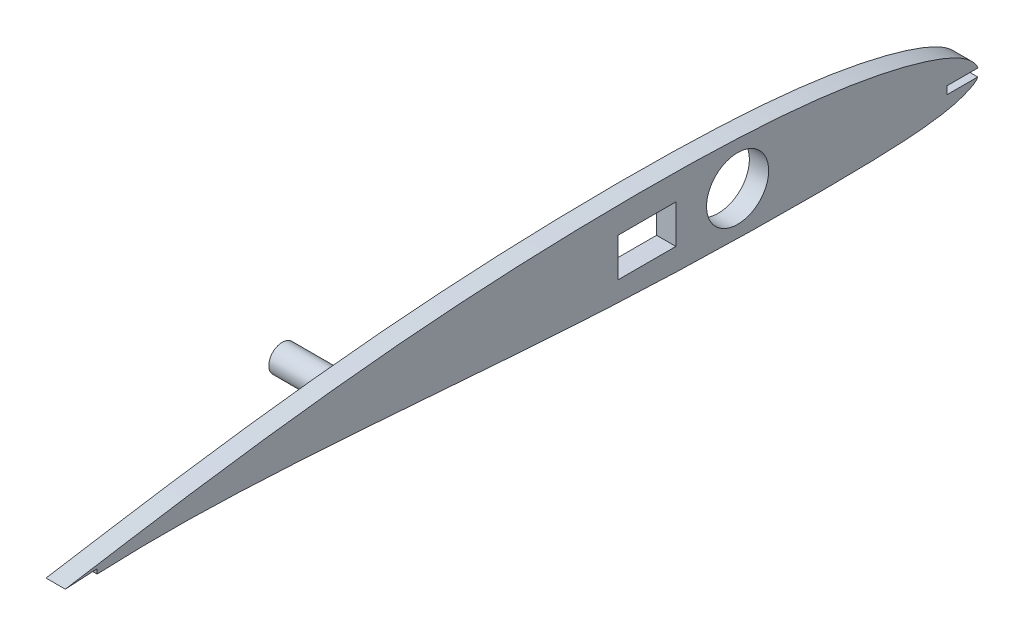
ISO-10303-21;
HEADER;
FILE_DESCRIPTION(('STEP AP214'),'2;1');
FILE_NAME('part.step','',(''),(''),'','','');
FILE_SCHEMA(('AUTOMOTIVE_DESIGN { 1 0 10303 214 1 1 1 1 }'));
ENDSEC;
DATA;
#1=APPLICATION_CONTEXT('core data for automotive mechanical design processes');
#2=APPLICATION_PROTOCOL_DEFINITION('international standard','automotive_design',2000,#1);
#3=PRODUCT_CONTEXT('',#1,'mechanical');
#4=PRODUCT('Part','Part','',(#3));
#5=PRODUCT_RELATED_PRODUCT_CATEGORY('part','',(#4));
#6=PRODUCT_DEFINITION_FORMATION('','',#4);
#7=PRODUCT_DEFINITION_CONTEXT('part definition',#1,'design');
#8=PRODUCT_DEFINITION('design','',#6,#7);
#9=PRODUCT_DEFINITION_SHAPE('','',#8);
#10=(LENGTH_UNIT() NAMED_UNIT(*) SI_UNIT(.MILLI.,.METRE.));
#11=(NAMED_UNIT(*) PLANE_ANGLE_UNIT() SI_UNIT($,.RADIAN.));
#12=(NAMED_UNIT(*) SI_UNIT($,.STERADIAN.) SOLID_ANGLE_UNIT());
#13=UNCERTAINTY_MEASURE_WITH_UNIT(LENGTH_MEASURE(1.E-05),#10,'distance_accuracy_value','');
#14=(GEOMETRIC_REPRESENTATION_CONTEXT(3) GLOBAL_UNCERTAINTY_ASSIGNED_CONTEXT((#13)) GLOBAL_UNIT_ASSIGNED_CONTEXT((#10,
#11,#12)) REPRESENTATION_CONTEXT('',''));
#15=CARTESIAN_POINT('',(0.,0.,0.));
#16=DIRECTION('',(0.,0.,1.));
#17=DIRECTION('',(1.,0.,0.));
#18=AXIS2_PLACEMENT_3D('',#15,#16,#17);
#19=CARTESIAN_POINT('',(5.,0.,250.));
#20=CARTESIAN_POINT('',(5.,-0.0080427959719715,250.000228293678));
#21=CARTESIAN_POINT('',(5.,0.172375657967406,248.284955515532));
#22=CARTESIAN_POINT('',(5.,0.308690014795419,246.518112419387));
#23=CARTESIAN_POINT('',(5.,0.685693593852336,242.189387343398));
#24=CARTESIAN_POINT('',(5.,1.07410152891603,236.806461263496));
#25=CARTESIAN_POINT('',(5.,1.49731723995003,229.680385951639));
#26=CARTESIAN_POINT('',(5.,1.8232186026768,221.18415869828));
#27=CARTESIAN_POINT('',(5.,1.96762610068065,211.337618207726));
#28=CARTESIAN_POINT('',(5.,1.83322105638369,200.371188527109));
#29=CARTESIAN_POINT('',(5.,1.38960528984164,188.499913622482));
#30=CARTESIAN_POINT('',(5.,0.706014078000893,175.953687417433));
#31=CARTESIAN_POINT('',(5.,-0.160208641561513,162.931424917666));
#32=CARTESIAN_POINT('',(5.,-1.14801632724376,149.615771743617));
#33=CARTESIAN_POINT('',(5.,-2.19092490983926,136.176354994724));
#34=CARTESIAN_POINT('',(5.,-3.21958397917046,122.767140548026));
#35=CARTESIAN_POINT('',(5.,-4.15274312671142,109.520053587455));
#36=CARTESIAN_POINT('',(5.,-4.93856436487493,96.5460959745437));
#37=CARTESIAN_POINT('',(5.,-5.53683070268675,83.9408193016427));
#38=CARTESIAN_POINT('',(5.,-5.94764820461108,71.8018392906514));
#39=CARTESIAN_POINT('',(5.,-6.21845093878312,60.2452560030716));
#40=CARTESIAN_POINT('',(5.,-6.35536975583973,49.3987328907547));
#41=CARTESIAN_POINT('',(5.,-6.38138796281789,39.3972261942655));
#42=CARTESIAN_POINT('',(5.,-6.26504923032313,30.3619348419668));
#43=CARTESIAN_POINT('',(5.,-6.01216491688521,22.4121811031587));
#44=CARTESIAN_POINT('',(5.,-5.59743390072595,15.6262272306516));
#45=CARTESIAN_POINT('',(5.,-4.92870657935606,10.0719075109048));
#46=CARTESIAN_POINT('',(5.,-4.04044698146404,5.69769261214423));
#47=CARTESIAN_POINT('',(5.,-2.8657529844069,2.62532063874475));
#48=CARTESIAN_POINT('',(5.,-1.7115284699546,0.494884225045661));
#49=CARTESIAN_POINT('',(5.,-0.410454230626488,-0.0213125491030087));
#50=CARTESIAN_POINT('',(5.,0.792659826704065,0.0311691995850224));
#51=CARTESIAN_POINT('',(5.,2.30568433693192,0.812599241892923));
#52=CARTESIAN_POINT('',(5.,4.23835242447377,2.72886351673443));
#53=CARTESIAN_POINT('',(5.,6.11817212106947,5.76990724125498));
#54=CARTESIAN_POINT('',(5.,7.91359420170391,9.88094280419771));
#55=CARTESIAN_POINT('',(5.,9.64131817838287,15.0749304677094));
#56=CARTESIAN_POINT('',(5.,11.2838964878058,21.2987522216172));
#57=CARTESIAN_POINT('',(5.,12.7883817585812,28.4971721202648));
#58=CARTESIAN_POINT('',(5.,14.0978349081275,36.6073734062479));
#59=CARTESIAN_POINT('',(5.,15.1594290171638,45.573028440303));
#60=CARTESIAN_POINT('',(5.,15.9609039979753,55.3329100744701));
#61=CARTESIAN_POINT('',(5.,16.4940697383882,65.8165364983871));
#62=CARTESIAN_POINT('',(5.,16.7919897051422,76.9313762604552));
#63=CARTESIAN_POINT('',(5.,16.864754130909,88.5669490281142));
#64=CARTESIAN_POINT('',(5.,16.7267152914356,100.596999885542));
#65=CARTESIAN_POINT('',(5.,16.3833850637257,112.888825982424));
#66=CARTESIAN_POINT('',(5.,15.825573666627,125.31161581915));
#67=CARTESIAN_POINT('',(5.,15.0523318700684,137.743791097076));
#68=CARTESIAN_POINT('',(5.,14.0593390742259,150.072384382085));
#69=CARTESIAN_POINT('',(5.,12.8815869860292,162.191375055682));
#70=CARTESIAN_POINT('',(5.,11.5492803460744,173.989074322246));
#71=CARTESIAN_POINT('',(5.,10.1162497290333,185.35236444642));
#72=CARTESIAN_POINT('',(5.,8.63237912523508,196.163081697706));
#73=CARTESIAN_POINT('',(5.,7.13151388385034,206.300441402258));
#74=CARTESIAN_POINT('',(5.,5.73122176805054,215.560350587015));
#75=CARTESIAN_POINT('',(5.,4.29329512716244,223.97715704258));
#76=CARTESIAN_POINT('',(5.,3.1818088737293,231.363413336396));
#77=CARTESIAN_POINT('',(5.,2.09894241729889,237.746440904332));
#78=CARTESIAN_POINT('',(5.,1.2458619166603,242.622069365861));
#79=CARTESIAN_POINT('',(5.,0.552864946230777,246.64452933247));
#80=CARTESIAN_POINT('',(5.,0.246216764640028,248.328398440367));
#81=CARTESIAN_POINT('',(5.,0.00797737724443801,249.999773563223));
#82=CARTESIAN_POINT('',(5.,0.,250.));
#83=B_SPLINE_CURVE_WITH_KNOTS('',3,(#19,#20,#21,#22,#23,#24,#25,#26,#27,#28,#29,#30,#31,#32,#33,
#34,#35,#36,#37,#38,#39,#40,#41,#42,#43,#44,#45,#46,#47,#48,#49,#50,#51,#52,#53,#54,#55,#56,#57,
#58,#59,#60,#61,#62,#63,#64,#65,#66,#67,#68,#69,#70,#71,#72,#73,#74,#75,#76,#77,#78,#79,#80,#81,
#82),.UNSPECIFIED.,.T.,.F.,(4,1,1,1,1,1,1,1,1,1,1,1,1,1,1,1,1,1,1,1,1,1,1,1,1,1,1,1,1,1,1,1,1,1,
1,1,1,1,1,1,1,1,1,1,1,1,1,1,1,1,1,1,1,1,1,1,1,1,1,1,1,4),(0.,0.00158888881614516,
0.00632921783555629,0.0142024564897436,0.0251728077530557,0.0391734833267743,0.0560606311759249,
0.0755789238487882,0.0973636066296903,0.120926258366677,0.145825281006277,0.171670911815127,
0.198108536705041,0.22479018357162,0.25139057978404,0.277643490654311,0.303326750051388,
0.328257458029316,0.352272548115194,0.375156061746876,0.396620664402003,0.416422729294005,
0.434304420097656,0.450054679859308,0.463465465082325,0.474478994238096,0.483169222153171,
0.489678354497499,0.494104066315722,0.496910015324886,0.497289784891853,0.501214273282496,
0.506457950332762,0.51335695674223,0.522168631834455,0.53296596992453,0.545689209241574,
0.56022077890382,0.57643892310517,0.594258689005965,0.613600244568652,0.634342385932902,
0.656331109263004,0.679351893859712,0.703152302846811,0.727478208080039,0.7520707394079,
0.776691163534608,0.801140183976245,0.825214386971546,0.848697423570622,0.871352857669295,
0.892947448931157,0.913230871058069,0.931955467148994,0.94834206907442,0.963693004275676,
0.976235918239566,0.986320058750392,0.993788799349345,0.998424034933867,1.),.UNSPECIFIED.);
#84=DIRECTION('',(-1.,0.,0.));
#85=VECTOR('',#84,1.);
#86=SURFACE_OF_LINEAR_EXTRUSION('',#83,#85);
#87=DIRECTION('',(-1.,0.,0.));
#88=VECTOR('',#87,1.);
#89=CARTESIAN_POINT('',(5.,2.2681446983294,236.731303844473));
#90=LINE('',#89,#88);
#91=CARTESIAN_POINT('',(5.,2.26814469832943,236.731303844473));
#92=VERTEX_POINT('',#91);
#93=CARTESIAN_POINT('',(0.,2.26814469832943,236.731303844473));
#94=VERTEX_POINT('',#93);
#95=EDGE_CURVE('E11',#92,#94,#90,.T.);
#96=ORIENTED_EDGE('',*,*,#95,.F.);
#97=CARTESIAN_POINT('',(5.,0.999994806564994,0.201514661045604));
#98=VERTEX_POINT('',#97);
#99=EDGE_CURVE('E139',#98,#92,#83,.T.);
#100=ORIENTED_EDGE('',*,*,#99,.F.);
#101=DIRECTION('',(-1.,0.,0.));
#102=VECTOR('',#101,1.);
#103=CARTESIAN_POINT('',(5.,0.999994806564946,0.201514676074837));
#104=LINE('',#103,#102);
#105=CARTESIAN_POINT('',(0.,0.999994806564946,0.201514676074837));
#106=VERTEX_POINT('',#105);
#107=EDGE_CURVE('E149',#98,#106,#104,.T.);
#108=ORIENTED_EDGE('',*,*,#107,.T.);
#109=CARTESIAN_POINT('',(0.,0.,250.));
#110=CARTESIAN_POINT('',(0.,-0.0080427959719715,250.000228293678));
#111=CARTESIAN_POINT('',(0.,0.172375657967406,248.284955515532));
#112=CARTESIAN_POINT('',(0.,0.308690014795419,246.518112419387));
#113=CARTESIAN_POINT('',(0.,0.685693593852336,242.189387343398));
#114=CARTESIAN_POINT('',(0.,1.07410152891603,236.806461263496));
#115=CARTESIAN_POINT('',(0.,1.49731723995003,229.680385951639));
#116=CARTESIAN_POINT('',(0.,1.8232186026768,221.18415869828));
#117=CARTESIAN_POINT('',(0.,1.96762610068065,211.337618207726));
#118=CARTESIAN_POINT('',(0.,1.83322105638369,200.371188527109));
#119=CARTESIAN_POINT('',(0.,1.38960528984164,188.499913622482));
#120=CARTESIAN_POINT('',(0.,0.706014078000893,175.953687417433));
#121=CARTESIAN_POINT('',(0.,-0.160208641561513,162.931424917666));
#122=CARTESIAN_POINT('',(0.,-1.14801632724376,149.615771743617));
#123=CARTESIAN_POINT('',(0.,-2.19092490983926,136.176354994724));
#124=CARTESIAN_POINT('',(0.,-3.21958397917046,122.767140548026));
#125=CARTESIAN_POINT('',(0.,-4.15274312671142,109.520053587455));
#126=CARTESIAN_POINT('',(0.,-4.93856436487493,96.5460959745437));
#127=CARTESIAN_POINT('',(0.,-5.53683070268675,83.9408193016427));
#128=CARTESIAN_POINT('',(0.,-5.94764820461108,71.8018392906514));
#129=CARTESIAN_POINT('',(0.,-6.21845093878312,60.2452560030716));
#130=CARTESIAN_POINT('',(0.,-6.35536975583973,49.3987328907547));
#131=CARTESIAN_POINT('',(0.,-6.38138796281789,39.3972261942655));
#132=CARTESIAN_POINT('',(0.,-6.26504923032313,30.3619348419668));
#133=CARTESIAN_POINT('',(0.,-6.01216491688521,22.4121811031587));
#134=CARTESIAN_POINT('',(0.,-5.59743390072595,15.6262272306516));
#135=CARTESIAN_POINT('',(0.,-4.92870657935606,10.0719075109048));
#136=CARTESIAN_POINT('',(0.,-4.04044698146404,5.69769261214423));
#137=CARTESIAN_POINT('',(0.,-2.8657529844069,2.62532063874475));
#138=CARTESIAN_POINT('',(0.,-1.7115284699546,0.494884225045661));
#139=CARTESIAN_POINT('',(0.,-0.410454230626488,-0.0213125491030087));
#140=CARTESIAN_POINT('',(0.,0.792659826704065,0.0311691995850224));
#141=CARTESIAN_POINT('',(0.,2.30568433693192,0.812599241892923));
#142=CARTESIAN_POINT('',(0.,4.23835242447377,2.72886351673443));
#143=CARTESIAN_POINT('',(0.,6.11817212106947,5.76990724125498));
#144=CARTESIAN_POINT('',(0.,7.91359420170391,9.88094280419771));
#145=CARTESIAN_POINT('',(0.,9.64131817838287,15.0749304677094));
#146=CARTESIAN_POINT('',(0.,11.2838964878058,21.2987522216172));
#147=CARTESIAN_POINT('',(0.,12.7883817585812,28.4971721202648));
#148=CARTESIAN_POINT('',(0.,14.0978349081275,36.6073734062479));
#149=CARTESIAN_POINT('',(0.,15.1594290171638,45.573028440303));
#150=CARTESIAN_POINT('',(0.,15.9609039979753,55.3329100744701));
#151=CARTESIAN_POINT('',(0.,16.4940697383882,65.8165364983871));
#152=CARTESIAN_POINT('',(0.,16.7919897051422,76.9313762604552));
#153=CARTESIAN_POINT('',(0.,16.864754130909,88.5669490281142));
#154=CARTESIAN_POINT('',(0.,16.7267152914356,100.596999885542));
#155=CARTESIAN_POINT('',(0.,16.3833850637257,112.888825982424));
#156=CARTESIAN_POINT('',(0.,15.825573666627,125.31161581915));
#157=CARTESIAN_POINT('',(0.,15.0523318700684,137.743791097076));
#158=CARTESIAN_POINT('',(0.,14.0593390742259,150.072384382085));
#159=CARTESIAN_POINT('',(0.,12.8815869860292,162.191375055682));
#160=CARTESIAN_POINT('',(0.,11.5492803460744,173.989074322246));
#161=CARTESIAN_POINT('',(0.,10.1162497290333,185.35236444642));
#162=CARTESIAN_POINT('',(0.,8.63237912523508,196.163081697706));
#163=CARTESIAN_POINT('',(0.,7.13151388385034,206.300441402258));
#164=CARTESIAN_POINT('',(0.,5.73122176805054,215.560350587015));
#165=CARTESIAN_POINT('',(0.,4.29329512716244,223.97715704258));
#166=CARTESIAN_POINT('',(0.,3.1818088737293,231.363413336396));
#167=CARTESIAN_POINT('',(0.,2.09894241729889,237.746440904332));
#168=CARTESIAN_POINT('',(0.,1.2458619166603,242.622069365861));
#169=CARTESIAN_POINT('',(0.,0.552864946230777,246.64452933247));
#170=CARTESIAN_POINT('',(0.,0.246216764640028,248.328398440367));
#171=CARTESIAN_POINT('',(0.,0.00797737724443801,249.999773563223));
#172=CARTESIAN_POINT('',(0.,0.,250.));
#173=B_SPLINE_CURVE_WITH_KNOTS('',3,(#109,#110,#111,#112,#113,#114,#115,#116,#117,#118,#119,
#120,#121,#122,#123,#124,#125,#126,#127,#128,#129,#130,#131,#132,#133,#134,#135,#136,#137,#138,
#139,#140,#141,#142,#143,#144,#145,#146,#147,#148,#149,#150,#151,#152,#153,#154,#155,#156,#157,
#158,#159,#160,#161,#162,#163,#164,#165,#166,#167,#168,#169,#170,#171,#172),.UNSPECIFIED.,.T.,
.F.,(4,1,1,1,1,1,1,1,1,1,1,1,1,1,1,1,1,1,1,1,1,1,1,1,1,1,1,1,1,1,1,1,1,1,1,1,1,1,1,1,1,1,1,1,1,
1,1,1,1,1,1,1,1,1,1,1,1,1,1,1,1,4),(0.,0.00158888881614516,0.00632921783555629,
0.0142024564897436,0.0251728077530557,0.0391734833267743,0.0560606311759249,0.0755789238487882,
0.0973636066296903,0.120926258366677,0.145825281006277,0.171670911815127,0.198108536705041,
0.22479018357162,0.25139057978404,0.277643490654311,0.303326750051388,0.328257458029316,
0.352272548115194,0.375156061746876,0.396620664402003,0.416422729294005,0.434304420097656,
0.450054679859308,0.463465465082325,0.474478994238096,0.483169222153171,0.489678354497499,
0.494104066315722,0.496910015324886,0.497289784891853,0.501214273282496,0.506457950332762,
0.51335695674223,0.522168631834455,0.53296596992453,0.545689209241574,0.56022077890382,
0.57643892310517,0.594258689005965,0.613600244568652,0.634342385932902,0.656331109263004,
0.679351893859712,0.703152302846811,0.727478208080039,0.7520707394079,0.776691163534608,
0.801140183976245,0.825214386971546,0.848697423570622,0.871352857669295,0.892947448931157,
0.913230871058069,0.931955467148994,0.94834206907442,0.963693004275676,0.976235918239566,
0.986320058750392,0.993788799349345,0.998424034933867,1.),.UNSPECIFIED.);
#174=EDGE_CURVE('E36',#106,#94,#173,.T.);
#175=ORIENTED_EDGE('',*,*,#174,.T.);
#176=EDGE_LOOP('',(#96,#100,#108,#175));
#177=FACE_BOUND('',#176,.T.);
#178=ADVANCED_FACE('F32',(#177),#86,.F.);
#179=CARTESIAN_POINT('',(5.,1.49711132773622,0.435092083404368));
#180=DIRECTION('',(-1.,0.,0.));
#181=DIRECTION('',(0.,0.,1.));
#182=AXIS2_PLACEMENT_3D('',#179,#180,#181);
#183=PLANE('',#182);
#184=CARTESIAN_POINT('',(5.,5.07732270373844,62.4999197093942));
#185=DIRECTION('',(1.,0.,0.));
#186=DIRECTION('',(0.,0.,-1.));
#187=AXIS2_PLACEMENT_3D('',#184,#185,#186);
#188=CIRCLE('',#187,8.05);
#189=CARTESIAN_POINT('',(5.,5.07732270373844,54.4499197093942));
#190=VERTEX_POINT('',#189);
#191=EDGE_CURVE('E155',#190,#190,#188,.T.);
#192=ORIENTED_EDGE('',*,*,#191,.F.);
#193=EDGE_LOOP('',(#192));
#194=FACE_BOUND('',#193,.T.);
#195=ORIENTED_EDGE('',*,*,#99,.T.);
#196=DIRECTION('',(0.,0.0556361766390674,-0.998451108391886));
#197=VECTOR('',#196,1.);
#198=CARTESIAN_POINT('',(5.,2.26814469832943,236.731303844473));
#199=LINE('',#198,#197);
#200=CARTESIAN_POINT('',(5.,2.72436134676978,228.544004755659));
#201=VERTEX_POINT('',#200);
#202=EDGE_CURVE('E132',#92,#201,#199,.T.);
#203=ORIENTED_EDGE('',*,*,#202,.T.);
#204=DIRECTION('',(0.,-0.998451108391884,-0.0556361766391083));
#205=VECTOR('',#204,1.);
#206=CARTESIAN_POINT('',(5.,2.72436134676978,228.544004755659));
#207=LINE('',#206,#205);
#208=CARTESIAN_POINT('',(5.,1.52622001669952,228.477241343692));
#209=VERTEX_POINT('',#208);
#210=EDGE_CURVE('E116',#201,#209,#207,.T.);
#211=ORIENTED_EDGE('',*,*,#210,.T.);
#212=CARTESIAN_POINT('',(5.,-1.00000520564392,0.266537777160303));
#213=VERTEX_POINT('',#212);
#214=EDGE_CURVE('E130',#209,#213,#83,.T.);
#215=ORIENTED_EDGE('',*,*,#214,.T.);
#216=DIRECTION('',(0.,0.,-1.));
#217=VECTOR('',#216,1.);
#218=CARTESIAN_POINT('',(5.,-1.00000519343501,8.19991970488098));
#219=LINE('',#218,#217);
#220=CARTESIAN_POINT('',(5.,-1.00000519343501,8.19991970488098));
#221=VERTEX_POINT('',#220);
#222=EDGE_CURVE('E205',#221,#213,#219,.T.);
#223=ORIENTED_EDGE('',*,*,#222,.F.);
#224=DIRECTION('',(0.,-1.,0.));
#225=VECTOR('',#224,1.);
#226=CARTESIAN_POINT('',(5.,0.999994806564994,8.19991970488098));
#227=LINE('',#226,#225);
#228=CARTESIAN_POINT('',(5.,0.999994806564994,8.19991970488098));
#229=VERTEX_POINT('',#228);
#230=EDGE_CURVE('E200',#229,#221,#227,.T.);
#231=ORIENTED_EDGE('',*,*,#230,.F.);
#232=DIRECTION('',(0.,0.,1.));
#233=VECTOR('',#232,1.);
#234=CARTESIAN_POINT('',(5.,0.999994806564994,8.19991970488098));
#235=LINE('',#234,#233);
#236=EDGE_CURVE('E199',#98,#229,#235,.T.);
#237=ORIENTED_EDGE('',*,*,#236,.F.);
#238=EDGE_LOOP('',(#195,#203,#211,#215,#223,#231,#237));
#239=FACE_BOUND('',#238,.T.);
#240=DIRECTION('',(0.,1.,0.));
#241=VECTOR('',#240,1.);
#242=CARTESIAN_POINT('',(5.,10.0773227037384,78.4999197093942));
#243=LINE('',#242,#241);
#244=CARTESIAN_POINT('',(5.,0.0773227037384437,78.4999197093942));
#245=VERTEX_POINT('',#244);
#246=CARTESIAN_POINT('',(5.,10.0773227037384,78.4999197093942));
#247=VERTEX_POINT('',#246);
#248=EDGE_CURVE('E158',#245,#247,#243,.T.);
#249=ORIENTED_EDGE('',*,*,#248,.F.);
#250=DIRECTION('',(0.,0.,-1.));
#251=VECTOR('',#250,1.);
#252=CARTESIAN_POINT('',(5.,0.0773227037384437,78.4999197093942));
#253=LINE('',#252,#251);
#254=CARTESIAN_POINT('',(5.,0.0773227037384437,93.4999197093942));
#255=VERTEX_POINT('',#254);
#256=EDGE_CURVE('E176',#255,#245,#253,.T.);
#257=ORIENTED_EDGE('',*,*,#256,.F.);
#258=DIRECTION('',(0.,-1.,0.));
#259=VECTOR('',#258,1.);
#260=CARTESIAN_POINT('',(5.,10.0773227037384,93.4999197093942));
#261=LINE('',#260,#259);
#262=CARTESIAN_POINT('',(5.,10.0773227037384,93.4999197093942));
#263=VERTEX_POINT('',#262);
#264=EDGE_CURVE('E173',#263,#255,#261,.T.);
#265=ORIENTED_EDGE('',*,*,#264,.F.);
#266=DIRECTION('',(0.,0.,1.));
#267=VECTOR('',#266,1.);
#268=CARTESIAN_POINT('',(5.,10.0773227037384,78.4999197093942));
#269=LINE('',#268,#267);
#270=EDGE_CURVE('E170',#247,#263,#269,.T.);
#271=ORIENTED_EDGE('',*,*,#270,.F.);
#272=EDGE_LOOP('',(#249,#257,#265,#271));
#273=FACE_BOUND('',#272,.T.);
#274=ADVANCED_FACE('F34',(#194,#239,#273),#183,.F.);
#275=CARTESIAN_POINT('',(0.,1.49711132773622,0.435092083404368));
#276=DIRECTION('',(-1.,0.,0.));
#277=DIRECTION('',(0.,0.,1.));
#278=AXIS2_PLACEMENT_3D('',#275,#276,#277);
#279=PLANE('',#278);
#280=DIRECTION('',(0.,0.0556361766390674,-0.998451108391886));
#281=VECTOR('',#280,1.);
#282=CARTESIAN_POINT('',(0.,2.26814469832943,236.731303844473));
#283=LINE('',#282,#281);
#284=CARTESIAN_POINT('',(0.,2.72436134676978,228.544004755659));
#285=VERTEX_POINT('',#284);
#286=EDGE_CURVE('E44',#94,#285,#283,.T.);
#287=ORIENTED_EDGE('',*,*,#286,.F.);
#288=ORIENTED_EDGE('',*,*,#174,.F.);
#289=DIRECTION('',(0.,0.,-1.));
#290=VECTOR('',#289,1.);
#291=CARTESIAN_POINT('',(0.,0.999994806564994,0.435092083404368));
#292=LINE('',#291,#290);
#293=CARTESIAN_POINT('',(0.,0.999994806564994,8.19991970488098));
#294=VERTEX_POINT('',#293);
#295=EDGE_CURVE('E197',#294,#106,#292,.T.);
#296=ORIENTED_EDGE('',*,*,#295,.F.);
#297=DIRECTION('',(0.,1.,0.));
#298=VECTOR('',#297,1.);
#299=CARTESIAN_POINT('',(0.,1.49711132773622,8.19991970488098));
#300=LINE('',#299,#298);
#301=CARTESIAN_POINT('',(0.,-1.00000519343501,8.19991970488098));
#302=VERTEX_POINT('',#301);
#303=EDGE_CURVE('E164',#302,#294,#300,.T.);
#304=ORIENTED_EDGE('',*,*,#303,.F.);
#305=DIRECTION('',(0.,0.,1.));
#306=VECTOR('',#305,1.);
#307=CARTESIAN_POINT('',(0.,-1.000005193435,0.435092083404367));
#308=LINE('',#307,#306);
#309=CARTESIAN_POINT('',(0.,-1.00000519343502,0.266537770752891));
#310=VERTEX_POINT('',#309);
#311=EDGE_CURVE('E201',#310,#302,#308,.T.);
#312=ORIENTED_EDGE('',*,*,#311,.F.);
#313=CARTESIAN_POINT('',(0.,1.52622001669951,228.477241343692));
#314=VERTEX_POINT('',#313);
#315=EDGE_CURVE('E123',#314,#310,#173,.T.);
#316=ORIENTED_EDGE('',*,*,#315,.F.);
#317=DIRECTION('',(0.,-0.998451108391884,-0.0556361766391083));
#318=VECTOR('',#317,1.);
#319=CARTESIAN_POINT('',(0.,2.72436134676978,228.544004755659));
#320=LINE('',#319,#318);
#321=EDGE_CURVE('E119',#285,#314,#320,.T.);
#322=ORIENTED_EDGE('',*,*,#321,.F.);
#323=EDGE_LOOP('',(#287,#288,#296,#304,#312,#316,#322));
#324=FACE_BOUND('',#323,.T.);
#325=CARTESIAN_POINT('',(0.,6.07732270373844,160.499919709394));
#326=DIRECTION('',(-1.,0.,0.));
#327=DIRECTION('',(0.,0.,1.));
#328=AXIS2_PLACEMENT_3D('',#325,#326,#327);
#329=CIRCLE('',#328,3.49999999999999);
#330=CARTESIAN_POINT('',(0.,6.07732270373844,163.999919709394));
#331=VERTEX_POINT('',#330);
#332=EDGE_CURVE('E162',#331,#331,#329,.T.);
#333=ORIENTED_EDGE('',*,*,#332,.F.);
#334=EDGE_LOOP('',(#333));
#335=FACE_BOUND('',#334,.T.);
#336=CARTESIAN_POINT('',(0.,5.07732270373844,62.4999197093942));
#337=DIRECTION('',(1.,0.,0.));
#338=DIRECTION('',(0.,0.,-1.));
#339=AXIS2_PLACEMENT_3D('',#336,#337,#338);
#340=CIRCLE('',#339,8.05);
#341=CARTESIAN_POINT('',(0.,5.07732270373844,54.4499197093942));
#342=VERTEX_POINT('',#341);
#343=EDGE_CURVE('E138',#342,#342,#340,.T.);
#344=ORIENTED_EDGE('',*,*,#343,.T.);
#345=EDGE_LOOP('',(#344));
#346=FACE_BOUND('',#345,.T.);
#347=DIRECTION('',(0.,0.,-1.));
#348=VECTOR('',#347,1.);
#349=CARTESIAN_POINT('',(0.,0.0773227037384437,78.4999197093942));
#350=LINE('',#349,#348);
#351=CARTESIAN_POINT('',(0.,0.0773227037384437,93.4999197093942));
#352=VERTEX_POINT('',#351);
#353=CARTESIAN_POINT('',(0.,0.0773227037384437,78.4999197093942));
#354=VERTEX_POINT('',#353);
#355=EDGE_CURVE('E141',#352,#354,#350,.T.);
#356=ORIENTED_EDGE('',*,*,#355,.T.);
#357=DIRECTION('',(0.,1.,0.));
#358=VECTOR('',#357,1.);
#359=CARTESIAN_POINT('',(0.,10.0773227037384,78.4999197093942));
#360=LINE('',#359,#358);
#361=CARTESIAN_POINT('',(0.,10.0773227037384,78.4999197093942));
#362=VERTEX_POINT('',#361);
#363=EDGE_CURVE('E182',#354,#362,#360,.T.);
#364=ORIENTED_EDGE('',*,*,#363,.T.);
#365=DIRECTION('',(0.,0.,1.));
#366=VECTOR('',#365,1.);
#367=CARTESIAN_POINT('',(0.,10.0773227037384,78.4999197093942));
#368=LINE('',#367,#366);
#369=CARTESIAN_POINT('',(0.,10.0773227037384,93.4999197093942));
#370=VERTEX_POINT('',#369);
#371=EDGE_CURVE('E185',#362,#370,#368,.T.);
#372=ORIENTED_EDGE('',*,*,#371,.T.);
#373=DIRECTION('',(0.,-1.,0.));
#374=VECTOR('',#373,1.);
#375=CARTESIAN_POINT('',(0.,10.0773227037384,93.4999197093942));
#376=LINE('',#375,#374);
#377=EDGE_CURVE('E124',#370,#352,#376,.T.);
#378=ORIENTED_EDGE('',*,*,#377,.T.);
#379=EDGE_LOOP('',(#356,#364,#372,#378));
#380=FACE_BOUND('',#379,.T.);
#381=ADVANCED_FACE('F219',(#324,#335,#346,#380),#279,.T.);
#382=ORIENTED_EDGE('',*,*,#214,.F.);
#383=DIRECTION('',(-1.,0.,0.));
#384=VECTOR('',#383,1.);
#385=CARTESIAN_POINT('',(5.,1.52622001669952,228.477241343692));
#386=LINE('',#385,#384);
#387=EDGE_CURVE('E113',#209,#314,#386,.T.);
#388=ORIENTED_EDGE('',*,*,#387,.T.);
#389=ORIENTED_EDGE('',*,*,#315,.T.);
#390=DIRECTION('',(-1.,0.,0.));
#391=VECTOR('',#390,1.);
#392=CARTESIAN_POINT('',(5.,-1.00000519343502,0.266537770752891));
#393=LINE('',#392,#391);
#394=EDGE_CURVE('E137',#310,#213,#393,.F.);
#395=ORIENTED_EDGE('',*,*,#394,.T.);
#396=EDGE_LOOP('',(#382,#388,#389,#395));
#397=FACE_BOUND('',#396,.T.);
#398=ADVANCED_FACE('F135',(#397),#86,.F.);
#399=CARTESIAN_POINT('',(5.,5.07732270373844,62.4999197093942));
#400=DIRECTION('',(-1.,0.,0.));
#401=DIRECTION('',(0.,0.,1.));
#402=AXIS2_PLACEMENT_3D('',#399,#400,#401);
#403=CYLINDRICAL_SURFACE('',#402,8.05);
#404=ORIENTED_EDGE('',*,*,#191,.T.);
#405=EDGE_LOOP('',(#404));
#406=FACE_BOUND('',#405,.T.);
#407=ORIENTED_EDGE('',*,*,#343,.F.);
#408=EDGE_LOOP('',(#407));
#409=FACE_BOUND('',#408,.T.);
#410=ADVANCED_FACE('F251',(#406,#409),#403,.F.);
#411=CARTESIAN_POINT('',(5.,10.0773227037384,78.4999197093942));
#412=DIRECTION('',(0.,0.,1.));
#413=DIRECTION('',(1.,0.,0.));
#414=AXIS2_PLACEMENT_3D('',#411,#412,#413);
#415=PLANE('',#414);
#416=ORIENTED_EDGE('',*,*,#363,.F.);
#417=DIRECTION('',(-1.,0.,0.));
#418=VECTOR('',#417,1.);
#419=CARTESIAN_POINT('',(5.,0.0773227037384437,78.4999197093942));
#420=LINE('',#419,#418);
#421=EDGE_CURVE('E177',#245,#354,#420,.T.);
#422=ORIENTED_EDGE('',*,*,#421,.F.);
#423=ORIENTED_EDGE('',*,*,#248,.T.);
#424=DIRECTION('',(-1.,0.,0.));
#425=VECTOR('',#424,1.);
#426=CARTESIAN_POINT('',(5.,10.0773227037384,78.4999197093942));
#427=LINE('',#426,#425);
#428=EDGE_CURVE('E167',#247,#362,#427,.T.);
#429=ORIENTED_EDGE('',*,*,#428,.T.);
#430=EDGE_LOOP('',(#416,#422,#423,#429));
#431=FACE_BOUND('',#430,.T.);
#432=ADVANCED_FACE('F256',(#431),#415,.T.);
#433=CARTESIAN_POINT('',(5.,10.0773227037384,78.4999197093942));
#434=DIRECTION('',(0.,-1.,0.));
#435=DIRECTION('',(0.,0.,-1.));
#436=AXIS2_PLACEMENT_3D('',#433,#434,#435);
#437=PLANE('',#436);
#438=ORIENTED_EDGE('',*,*,#371,.F.);
#439=ORIENTED_EDGE('',*,*,#428,.F.);
#440=ORIENTED_EDGE('',*,*,#270,.T.);
#441=DIRECTION('',(-1.,0.,0.));
#442=VECTOR('',#441,1.);
#443=CARTESIAN_POINT('',(5.,10.0773227037384,93.4999197093942));
#444=LINE('',#443,#442);
#445=EDGE_CURVE('E171',#263,#370,#444,.T.);
#446=ORIENTED_EDGE('',*,*,#445,.T.);
#447=EDGE_LOOP('',(#438,#439,#440,#446));
#448=FACE_BOUND('',#447,.T.);
#449=ADVANCED_FACE('F293',(#448),#437,.T.);
#450=CARTESIAN_POINT('',(5.,10.0773227037384,93.4999197093942));
#451=DIRECTION('',(0.,0.,-1.));
#452=DIRECTION('',(-1.,0.,0.));
#453=AXIS2_PLACEMENT_3D('',#450,#451,#452);
#454=PLANE('',#453);
#455=ORIENTED_EDGE('',*,*,#377,.F.);
#456=ORIENTED_EDGE('',*,*,#445,.F.);
#457=ORIENTED_EDGE('',*,*,#264,.T.);
#458=DIRECTION('',(-1.,0.,0.));
#459=VECTOR('',#458,1.);
#460=CARTESIAN_POINT('',(5.,0.0773227037384437,93.4999197093942));
#461=LINE('',#460,#459);
#462=EDGE_CURVE('E174',#255,#352,#461,.T.);
#463=ORIENTED_EDGE('',*,*,#462,.T.);
#464=EDGE_LOOP('',(#455,#456,#457,#463));
#465=FACE_BOUND('',#464,.T.);
#466=ADVANCED_FACE('F302',(#465),#454,.T.);
#467=CARTESIAN_POINT('',(5.,0.0773227037384437,78.4999197093942));
#468=DIRECTION('',(0.,1.,0.));
#469=DIRECTION('',(0.,0.,1.));
#470=AXIS2_PLACEMENT_3D('',#467,#468,#469);
#471=PLANE('',#470);
#472=ORIENTED_EDGE('',*,*,#355,.F.);
#473=ORIENTED_EDGE('',*,*,#462,.F.);
#474=ORIENTED_EDGE('',*,*,#256,.T.);
#475=ORIENTED_EDGE('',*,*,#421,.T.);
#476=EDGE_LOOP('',(#472,#473,#474,#475));
#477=FACE_BOUND('',#476,.T.);
#478=ADVANCED_FACE('F311',(#477),#471,.T.);
#479=CARTESIAN_POINT('',(-15.,6.07732270373844,160.499919709394));
#480=DIRECTION('',(-1.,0.,0.));
#481=DIRECTION('',(0.,0.,1.));
#482=AXIS2_PLACEMENT_3D('',#479,#480,#481);
#483=PLANE('',#482);
#484=CARTESIAN_POINT('',(-15.,6.07732270373844,160.499919709394));
#485=DIRECTION('',(-1.,0.,0.));
#486=DIRECTION('',(0.,0.,1.));
#487=AXIS2_PLACEMENT_3D('',#484,#485,#486);
#488=CIRCLE('',#487,3.49999999999999);
#489=CARTESIAN_POINT('',(-15.,6.07732270373844,163.999919709394));
#490=VERTEX_POINT('',#489);
#491=EDGE_CURVE('E165',#490,#490,#488,.T.);
#492=ORIENTED_EDGE('',*,*,#491,.T.);
#493=EDGE_LOOP('',(#492));
#494=FACE_BOUND('',#493,.T.);
#495=ADVANCED_FACE('F320',(#494),#483,.T.);
#496=CARTESIAN_POINT('',(20.,6.07732270373844,160.499919709394));
#497=DIRECTION('',(-1.,0.,0.));
#498=DIRECTION('',(0.,0.,1.));
#499=AXIS2_PLACEMENT_3D('',#496,#497,#498);
#500=CYLINDRICAL_SURFACE('',#499,3.49999999999999);
#501=ORIENTED_EDGE('',*,*,#332,.T.);
#502=EDGE_LOOP('',(#501));
#503=FACE_BOUND('',#502,.T.);
#504=ORIENTED_EDGE('',*,*,#491,.F.);
#505=EDGE_LOOP('',(#504));
#506=FACE_BOUND('',#505,.T.);
#507=ADVANCED_FACE('F240',(#503,#506),#500,.T.);
#508=CARTESIAN_POINT('',(-15.,0.999994806564994,8.19991970488098));
#509=DIRECTION('',(0.,0.,1.));
#510=DIRECTION('',(0.,-1.,0.));
#511=AXIS2_PLACEMENT_3D('',#508,#509,#510);
#512=PLANE('',#511);
#513=ORIENTED_EDGE('',*,*,#303,.T.);
#514=DIRECTION('',(1.,0.,0.));
#515=VECTOR('',#514,1.);
#516=CARTESIAN_POINT('',(-15.,0.999994806564994,8.19991970488098));
#517=LINE('',#516,#515);
#518=EDGE_CURVE('E206',#294,#229,#517,.T.);
#519=ORIENTED_EDGE('',*,*,#518,.T.);
#520=ORIENTED_EDGE('',*,*,#230,.T.);
#521=DIRECTION('',(1.,0.,0.));
#522=VECTOR('',#521,1.);
#523=CARTESIAN_POINT('',(-15.,-1.00000519343501,8.19991970488098));
#524=LINE('',#523,#522);
#525=EDGE_CURVE('E203',#302,#221,#524,.T.);
#526=ORIENTED_EDGE('',*,*,#525,.F.);
#527=EDGE_LOOP('',(#513,#519,#520,#526));
#528=FACE_BOUND('',#527,.T.);
#529=ADVANCED_FACE('F228',(#528),#512,.F.);
#530=CARTESIAN_POINT('',(-15.,0.999994806564994,8.19991970488098));
#531=DIRECTION('',(0.,1.,0.));
#532=DIRECTION('',(0.,0.,1.));
#533=AXIS2_PLACEMENT_3D('',#530,#531,#532);
#534=PLANE('',#533);
#535=ORIENTED_EDGE('',*,*,#295,.T.);
#536=ORIENTED_EDGE('',*,*,#107,.F.);
#537=ORIENTED_EDGE('',*,*,#236,.T.);
#538=ORIENTED_EDGE('',*,*,#518,.F.);
#539=EDGE_LOOP('',(#535,#536,#537,#538));
#540=FACE_BOUND('',#539,.T.);
#541=ADVANCED_FACE('F232',(#540),#534,.F.);
#542=CARTESIAN_POINT('',(-15.,-1.00000519343501,8.19991970488098));
#543=DIRECTION('',(0.,-1.,0.));
#544=DIRECTION('',(0.,0.,-1.));
#545=AXIS2_PLACEMENT_3D('',#542,#543,#544);
#546=PLANE('',#545);
#547=ORIENTED_EDGE('',*,*,#311,.T.);
#548=ORIENTED_EDGE('',*,*,#525,.T.);
#549=ORIENTED_EDGE('',*,*,#222,.T.);
#550=ORIENTED_EDGE('',*,*,#394,.F.);
#551=EDGE_LOOP('',(#547,#548,#549,#550));
#552=FACE_BOUND('',#551,.T.);
#553=ADVANCED_FACE('F226',(#552),#546,.F.);
#554=CARTESIAN_POINT('',(5.,2.72436134676978,228.544004755659));
#555=DIRECTION('',(0.,0.0556361766391083,-0.998451108391884));
#556=DIRECTION('',(0.,0.998451108391884,0.0556361766391083));
#557=AXIS2_PLACEMENT_3D('',#554,#555,#556);
#558=PLANE('',#557);
#559=ORIENTED_EDGE('',*,*,#321,.T.);
#560=ORIENTED_EDGE('',*,*,#387,.F.);
#561=ORIENTED_EDGE('',*,*,#210,.F.);
#562=DIRECTION('',(-1.,0.,0.));
#563=VECTOR('',#562,1.);
#564=CARTESIAN_POINT('',(5.,2.72436134676978,228.544004755659));
#565=LINE('',#564,#563);
#566=EDGE_CURVE('E213',#201,#285,#565,.T.);
#567=ORIENTED_EDGE('',*,*,#566,.T.);
#568=EDGE_LOOP('',(#559,#560,#561,#567));
#569=FACE_BOUND('',#568,.T.);
#570=ADVANCED_FACE('F115',(#569),#558,.F.);
#571=CARTESIAN_POINT('',(5.,2.26814469832943,236.731303844473));
#572=DIRECTION('',(0.,0.998451108391886,0.0556361766390674));
#573=DIRECTION('',(0.,-0.0556361766390674,0.998451108391886));
#574=AXIS2_PLACEMENT_3D('',#571,#572,#573);
#575=PLANE('',#574);
#576=ORIENTED_EDGE('',*,*,#286,.T.);
#577=ORIENTED_EDGE('',*,*,#566,.F.);
#578=ORIENTED_EDGE('',*,*,#202,.F.);
#579=ORIENTED_EDGE('',*,*,#95,.T.);
#580=EDGE_LOOP('',(#576,#577,#578,#579));
#581=FACE_BOUND('',#580,.T.);
#582=ADVANCED_FACE('F217',(#581),#575,.F.);
#583=CLOSED_SHELL('',(#178,#274,#381,#398,#410,#432,#449,#466,#478,#495,#507,#529,#541,#553,
#570,#582));
#584=MANIFOLD_SOLID_BREP('B2',#583);
#585=ADVANCED_BREP_SHAPE_REPRESENTATION('',(#18,#584),#14);
#586=SHAPE_DEFINITION_REPRESENTATION(#9,#585);
ENDSEC;
END-ISO-10303-21;
